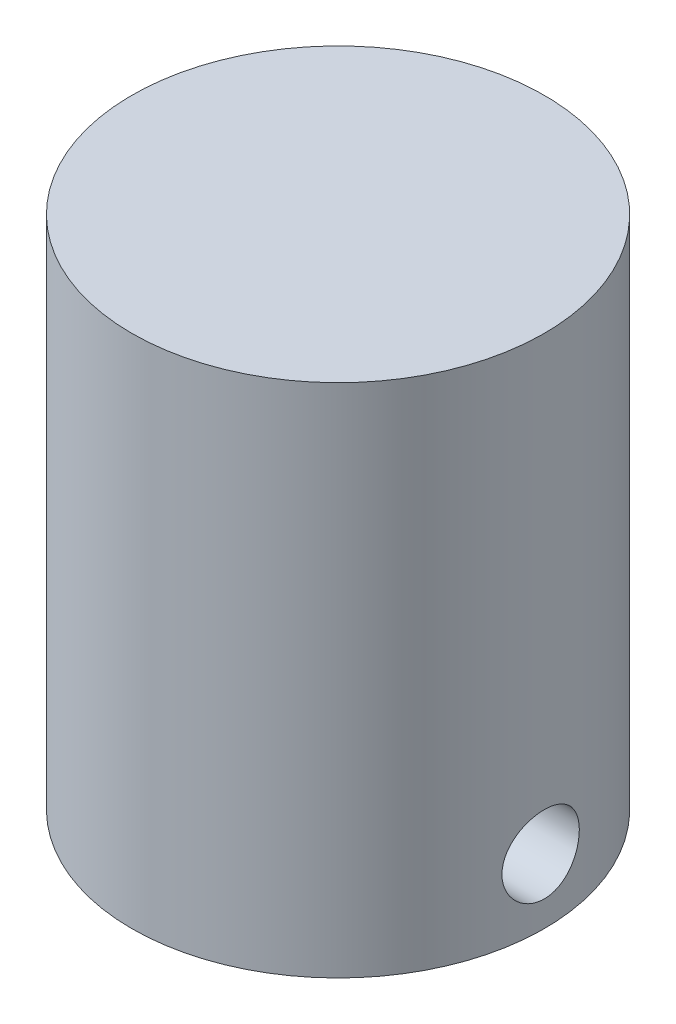
ISO-10303-21;
HEADER;
FILE_DESCRIPTION(('STEP AP214'),'2;1');
FILE_NAME('part.step','',(''),(''),'','','');
FILE_SCHEMA(('AUTOMOTIVE_DESIGN { 1 0 10303 214 1 1 1 1 }'));
ENDSEC;
DATA;
#1=APPLICATION_CONTEXT('core data for automotive mechanical design processes');
#2=APPLICATION_PROTOCOL_DEFINITION('international standard','automotive_design',2000,#1);
#3=PRODUCT_CONTEXT('',#1,'mechanical');
#4=PRODUCT('Part','Part','',(#3));
#5=PRODUCT_RELATED_PRODUCT_CATEGORY('part','',(#4));
#6=PRODUCT_DEFINITION_FORMATION('','',#4);
#7=PRODUCT_DEFINITION_CONTEXT('part definition',#1,'design');
#8=PRODUCT_DEFINITION('design','',#6,#7);
#9=PRODUCT_DEFINITION_SHAPE('','',#8);
#10=(LENGTH_UNIT() NAMED_UNIT(*) SI_UNIT(.MILLI.,.METRE.));
#11=(NAMED_UNIT(*) PLANE_ANGLE_UNIT() SI_UNIT($,.RADIAN.));
#12=(NAMED_UNIT(*) SI_UNIT($,.STERADIAN.) SOLID_ANGLE_UNIT());
#13=UNCERTAINTY_MEASURE_WITH_UNIT(LENGTH_MEASURE(1.E-05),#10,'distance_accuracy_value','');
#14=(GEOMETRIC_REPRESENTATION_CONTEXT(3) GLOBAL_UNCERTAINTY_ASSIGNED_CONTEXT((#13)) GLOBAL_UNIT_ASSIGNED_CONTEXT((#10,
#11,#12)) REPRESENTATION_CONTEXT('',''));
#15=CARTESIAN_POINT('',(0.,0.,0.));
#16=DIRECTION('',(0.,0.,1.));
#17=DIRECTION('',(1.,0.,0.));
#18=AXIS2_PLACEMENT_3D('',#15,#16,#17);
#19=CARTESIAN_POINT('',(0.,20.,0.));
#20=DIRECTION('',(0.,-1.,0.));
#21=DIRECTION('',(0.,0.,-1.));
#22=AXIS2_PLACEMENT_3D('',#19,#20,#21);
#23=CYLINDRICAL_SURFACE('',#22,8.);
#24=CARTESIAN_POINT('',(-8.,1.,0.));
#25=CARTESIAN_POINT('',(-7.99999848833852,1.00000318958828,-0.0834717464654709));
#26=CARTESIAN_POINT('',(-7.99868009921714,1.00699107661938,-0.166984992730098));
#27=CARTESIAN_POINT('',(-7.9935478589052,1.03473999511835,-0.331658129841798));
#28=CARTESIAN_POINT('',(-7.98973190166897,1.05551265063973,-0.412815974152226));
#29=CARTESIAN_POINT('',(-7.98003138765458,1.11017270125934,-0.570372961851801));
#30=CARTESIAN_POINT('',(-7.97414869946483,1.14404825245254,-0.646776330685344));
#31=CARTESIAN_POINT('',(-7.96095710599783,1.22391887692282,-0.792807973094006));
#32=CARTESIAN_POINT('',(-7.9536483161829,1.26991296914482,-0.862436794477323));
#33=CARTESIAN_POINT('',(-7.93831336430504,1.37329976800367,-0.993783715930503));
#34=CARTESIAN_POINT('',(-7.93028034856351,1.43080944467014,-1.05540895503183));
#35=CARTESIAN_POINT('',(-7.9144531845865,1.55534330908756,-1.16819606135369));
#36=CARTESIAN_POINT('',(-7.90665905354527,1.62236817976929,-1.21935717689241));
#37=CARTESIAN_POINT('',(-7.89212551245005,1.76468608836397,-1.31014998665793));
#38=CARTESIAN_POINT('',(-7.88539493886182,1.84004037031724,-1.34968721969605));
#39=CARTESIAN_POINT('',(-7.87384713211987,1.99646891517679,-1.41550524332283));
#40=CARTESIAN_POINT('',(-7.86902973396962,2.07754268411122,-1.44178717713098));
#41=CARTESIAN_POINT('',(-7.8619226957455,2.24211523091441,-1.480050535035));
#42=CARTESIAN_POINT('',(-7.85960445366405,2.32557509720346,-1.49219390192039));
#43=CARTESIAN_POINT('',(-7.85767197152761,2.49337738480825,-1.50233808095346));
#44=CARTESIAN_POINT('',(-7.8580574889876,2.5777197263023,-1.50034016135374));
#45=CARTESIAN_POINT('',(-7.86146292701753,2.74371952526605,-1.48238979602362));
#46=CARTESIAN_POINT('',(-7.86444808147334,2.82539771430015,-1.46662149996045));
#47=CARTESIAN_POINT('',(-7.87266183284666,2.98492841978261,-1.42186799396207));
#48=CARTESIAN_POINT('',(-7.87789052509516,3.0627807735093,-1.39288222239499));
#49=CARTESIAN_POINT('',(-7.89003855292589,3.21298867900027,-1.322336471793));
#50=CARTESIAN_POINT('',(-7.89696783823366,3.28530847058081,-1.28070213532456));
#51=CARTESIAN_POINT('',(-7.91172971602918,3.42200472854023,-1.18609368930416));
#52=CARTESIAN_POINT('',(-7.91956240015522,3.4863803877148,-1.13311842889266));
#53=CARTESIAN_POINT('',(-7.93540001272164,3.60642495567246,-1.01633905685298));
#54=CARTESIAN_POINT('',(-7.94340571024031,3.66194065245174,-0.952377436860682));
#55=CARTESIAN_POINT('',(-7.95857386108318,3.76147724067541,-0.815968037098826));
#56=CARTESIAN_POINT('',(-7.96573630595245,3.80549801687042,-0.743520172255769));
#57=CARTESIAN_POINT('',(-7.97842539677509,3.88081775387002,-0.592034988874667));
#58=CARTESIAN_POINT('',(-7.98394999136289,3.9121007791179,-0.512989564446493));
#59=CARTESIAN_POINT('',(-7.99272505402719,3.96090209309216,-0.350639115398696));
#60=CARTESIAN_POINT('',(-7.99597576367994,3.97842184404536,-0.267334544277786));
#61=CARTESIAN_POINT('',(-7.99980360641981,3.99898603101827,-0.100148652903384));
#62=CARTESIAN_POINT('',(-8.00041950912279,4.00224039152973,-0.0162940126341342));
#63=CARTESIAN_POINT('',(-7.99901543598228,3.99474452045235,0.150761248092185));
#64=CARTESIAN_POINT('',(-7.99699558964431,3.98399497693474,0.233961900480386));
#65=CARTESIAN_POINT('',(-7.99057111500406,3.94897096481663,0.396681573218218));
#66=CARTESIAN_POINT('',(-7.98618522374031,3.92480271746219,0.476224261046064));
#67=CARTESIAN_POINT('',(-7.97551842212498,3.86374229322121,0.630128631824634));
#68=CARTESIAN_POINT('',(-7.96923738311334,3.82684925243421,0.704489962595104));
#69=CARTESIAN_POINT('',(-7.95538030357666,3.74092187184049,0.846816671513215));
#70=CARTESIAN_POINT('',(-7.94779086174563,3.69175926146316,0.914703277015122));
#71=CARTESIAN_POINT('',(-7.93219343489711,3.58286186263764,1.04133832326455));
#72=CARTESIAN_POINT('',(-7.92418541084687,3.52312608699867,1.10008590976087));
#73=CARTESIAN_POINT('',(-7.9085247569745,3.39382768108857,1.20757295872048));
#74=CARTESIAN_POINT('',(-7.90087825860257,3.32414509187461,1.25616916218577));
#75=CARTESIAN_POINT('',(-7.88692985578532,3.17748237547625,1.34096675057787));
#76=CARTESIAN_POINT('',(-7.8806279013735,3.10050251962953,1.37716859613924));
#77=CARTESIAN_POINT('',(-7.87013024209574,2.94179413275746,1.43594673512823));
#78=CARTESIAN_POINT('',(-7.86592440436878,2.86009062044067,1.45858868794786));
#79=CARTESIAN_POINT('',(-7.86007203802415,2.6939527774786,1.48980679326235));
#80=CARTESIAN_POINT('',(-7.8584252206579,2.6095187560296,1.49838453270708));
#81=CARTESIAN_POINT('',(-7.85789199803857,2.44175166855849,1.50117762148355));
#82=CARTESIAN_POINT('',(-7.85896215974293,2.358422419043,1.49561895003499));
#83=CARTESIAN_POINT('',(-7.86364600659998,2.19390857795471,1.47079175378803));
#84=CARTESIAN_POINT('',(-7.86725967655747,2.11272397357256,1.45152331089332));
#85=CARTESIAN_POINT('',(-7.8766050802318,1.95492551520452,1.39991887583263));
#86=CARTESIAN_POINT('',(-7.88233284594965,1.87830340865423,1.36760735397252));
#87=CARTESIAN_POINT('',(-7.8952638755184,1.73153174575916,1.29085868912204));
#88=CARTESIAN_POINT('',(-7.90246724360119,1.66138264715522,1.24642068948186));
#89=CARTESIAN_POINT('',(-7.91767266107745,1.52841631995771,1.14589487339535));
#90=CARTESIAN_POINT('',(-7.92568505353043,1.4657245874329,1.08964259864303));
#91=CARTESIAN_POINT('',(-7.94152833918735,1.35059483753548,0.96742792674229));
#92=CARTESIAN_POINT('',(-7.94935919027328,1.29815917901986,0.901463301891614));
#93=CARTESIAN_POINT('',(-7.96403975968049,1.20458904737294,0.760984945071871));
#94=CARTESIAN_POINT('',(-7.97088000990561,1.16356057150936,0.686399590640516));
#95=CARTESIAN_POINT('',(-7.98271619380687,1.09468236339486,0.531290113653833));
#96=CARTESIAN_POINT('',(-7.98771385879037,1.06682025295309,0.450771651705247));
#97=CARTESIAN_POINT('',(-7.99428290707632,1.03072268558133,0.308347202825153));
#98=CARTESIAN_POINT('',(-7.99641470878206,1.0192213696872,0.24727381025187));
#99=CARTESIAN_POINT('',(-7.9992737995401,1.00385893788355,0.124141247115158));
#100=CARTESIAN_POINT('',(-8.00000112429805,0.999997627744093,0.0620821016527093));
#101=CARTESIAN_POINT('',(-8.,1.,0.));
#102=B_SPLINE_CURVE_WITH_KNOTS('',3,(#24,#25,#26,#27,#28,#29,#30,#31,#32,#33,#34,#35,#36,#37,
#38,#39,#40,#41,#42,#43,#44,#45,#46,#47,#48,#49,#50,#51,#52,#53,#54,#55,#56,#57,#58,#59,#60,#61,
#62,#63,#64,#65,#66,#67,#68,#69,#70,#71,#72,#73,#74,#75,#76,#77,#78,#79,#80,#81,#82,#83,#84,#85,
#86,#87,#88,#89,#90,#91,#92,#93,#94,#95,#96,#97,#98,#99,#100,#101),.UNSPECIFIED.,.T.,.F.,(4,2,2,
2,2,2,2,2,2,2,2,2,2,2,2,2,2,2,2,2,2,2,2,2,2,2,2,2,2,2,2,2,2,2,2,2,2,2,4),(0.,0.250188200964924,
0.500587642535452,0.750761271230907,1.00091465336891,1.2537511801363,1.50660586283617,
1.76146190504358,2.01629596311949,2.26818151445336,2.52004447587256,2.76859000612766,
3.01714609846787,3.26719262629531,3.51726454049859,3.77127768464077,4.02529337544948,
4.27962588321699,4.53393136673745,4.78448174076097,5.03501980464583,5.28360233907828,
5.53220175338032,5.78351778017708,6.03485728413098,6.28953436987299,6.54420198954945,
6.79762627818559,7.05102196946513,7.30039252231748,7.54976158541507,7.79866496207693,
8.04758592655423,8.3002336996638,8.55293951262255,8.80792048916314,9.06266126931173,
9.24874344524409,9.43482089039541),.UNSPECIFIED.);
#103=CARTESIAN_POINT('',(-8.,1.,0.));
#104=VERTEX_POINT('',#103);
#105=EDGE_CURVE('E89',#104,#104,#102,.T.);
#106=ORIENTED_EDGE('',*,*,#105,.T.);
#107=EDGE_LOOP('',(#106));
#108=FACE_BOUND('',#107,.T.);
#109=CARTESIAN_POINT('',(7.85811682275086,2.5,-1.5));
#110=CARTESIAN_POINT('',(7.85811843793494,2.41654279198826,-1.49999679883246));
#111=CARTESIAN_POINT('',(7.85946079760266,2.33304405178161,-1.49301126348936));
#112=CARTESIAN_POINT('',(7.86467851014364,2.16840103841809,-1.46527253251805));
#113=CARTESIAN_POINT('',(7.86855601173205,2.08725882357252,-1.44450765768477));
#114=CARTESIAN_POINT('',(7.87838976464885,1.92973492862913,-1.38987035617788));
#115=CARTESIAN_POINT('',(7.88434407905997,1.85334889069271,-1.35601013954374));
#116=CARTESIAN_POINT('',(7.89765826320959,1.70734644071319,-1.27617565760366));
#117=CARTESIAN_POINT('',(7.90501802325622,1.6377295009967,-1.23020233759193));
#118=CARTESIAN_POINT('',(7.92041614838944,1.50636980080087,-1.12683678942622));
#119=CARTESIAN_POINT('',(7.92846116625679,1.44472351652827,-1.06932292933092));
#120=CARTESIAN_POINT('',(7.94426457664034,1.33189561040044,-0.944771778803551));
#121=CARTESIAN_POINT('',(7.95202295031153,1.28071467557521,-0.877733863624944));
#122=CARTESIAN_POINT('',(7.96645017828405,1.18990062339948,-0.735403894570162));
#123=CARTESIAN_POINT('',(7.97311028052363,1.15035846648058,-0.660052840033866));
#124=CARTESIAN_POINT('',(7.98451608632931,1.08453045772647,-0.503631283250763));
#125=CARTESIAN_POINT('',(7.98926194728334,1.05824351600978,-0.422561251859506));
#126=CARTESIAN_POINT('',(7.99625755123778,1.01997045138887,-0.258002746187416));
#127=CARTESIAN_POINT('',(7.99853565976327,1.00782169407732,-0.174553323244857));
#128=CARTESIAN_POINT('',(8.00043684615594,0.997663112299599,-0.00677167603538324));
#129=CARTESIAN_POINT('',(8.00006015010697,0.999652083860943,0.0775604724476702));
#130=CARTESIAN_POINT('',(7.99671633763241,1.01758777114715,0.243598357899397));
#131=CARTESIAN_POINT('',(7.99378172247214,1.03335936943001,0.325323760451469));
#132=CARTESIAN_POINT('',(7.98568826333561,1.07813564939524,0.484947165715475));
#133=CARTESIAN_POINT('',(7.98052933829966,1.1071408133458,0.562845028826541));
#134=CARTESIAN_POINT('',(7.96851260297339,1.1777277310583,0.713110065751521));
#135=CARTESIAN_POINT('',(7.96164537590825,1.2193794879125,0.785443571838533));
#136=CARTESIAN_POINT('',(7.9469714754285,1.31402566907715,0.922159977214638));
#137=CARTESIAN_POINT('',(7.93916470651164,1.36702124688758,0.986542066910785));
#138=CARTESIAN_POINT('',(7.92333513680567,1.48381570298353,1.10656561896904));
#139=CARTESIAN_POINT('',(7.91531085901621,1.54776778390207,1.16205790757041));
#140=CARTESIAN_POINT('',(7.9000650892462,1.68414953127862,1.2615517185126));
#141=CARTESIAN_POINT('',(7.89284360901351,1.75657932176463,1.30555307271182));
#142=CARTESIAN_POINT('',(7.88001893307121,1.90805827070266,1.38085852224478));
#143=CARTESIAN_POINT('',(7.87441850530261,1.98711845719064,1.41214093645421));
#144=CARTESIAN_POINT('',(7.86551242396689,2.1495011841232,1.46093656975056));
#145=CARTESIAN_POINT('',(7.8622065103862,2.23282324046478,1.47845134901108));
#146=CARTESIAN_POINT('',(7.85831520301005,2.40001932885588,1.49899672649739));
#147=CARTESIAN_POINT('',(7.85768955816137,2.48386611556551,1.50224164285859));
#148=CARTESIAN_POINT('',(7.8591219142084,2.65090345508715,1.49472968881724));
#149=CARTESIAN_POINT('',(7.86117978238611,2.73409404014808,1.48397351086433));
#150=CARTESIAN_POINT('',(7.86770980063205,2.89675290305439,1.44894868195883));
#151=CARTESIAN_POINT('',(7.87216186690878,2.97624625262489,1.4247923858399));
#152=CARTESIAN_POINT('',(7.88296134156619,3.13005718973016,1.3637722437906));
#153=CARTESIAN_POINT('',(7.88930888963281,3.20437439531533,1.32690746128795));
#154=CARTESIAN_POINT('',(7.90327577863685,3.34666761904317,1.2410235311966));
#155=CARTESIAN_POINT('',(7.91090895425315,3.41456053786607,1.19186899639621));
#156=CARTESIAN_POINT('',(7.926548113681,3.54121204021433,1.08298344344247));
#157=CARTESIAN_POINT('',(7.93455413096494,3.59996980155577,1.02325147433084));
#158=CARTESIAN_POINT('',(7.95016624005946,3.70748376353413,0.893949417870386));
#159=CARTESIAN_POINT('',(7.95776555833305,3.75609582660596,0.824258534095891));
#160=CARTESIAN_POINT('',(7.97159404810351,3.84092120617766,0.677574523040141));
#161=CARTESIAN_POINT('',(7.97782327234725,3.87713500002501,0.600581677038529));
#162=CARTESIAN_POINT('',(7.98818057995848,3.93592009786408,0.441877541578684));
#163=CARTESIAN_POINT('',(7.99231954730142,3.95856218756141,0.360193213078988));
#164=CARTESIAN_POINT('',(7.99807642083745,3.98978704828989,0.194096227381571));
#165=CARTESIAN_POINT('',(7.99969459229933,3.99837129866271,0.109683858215851));
#166=CARTESIAN_POINT('',(8.00022227515441,4.00118530151844,-0.0580907602505092));
#167=CARTESIAN_POINT('',(7.99917286625032,3.99563275312953,-0.141449307066268));
#168=CARTESIAN_POINT('',(7.99456866611703,3.97080757223157,-0.306023369279199));
#169=CARTESIAN_POINT('',(7.99101389890671,3.95153507125579,-0.387238905213689));
#170=CARTESIAN_POINT('',(7.98179837978045,3.89990879261628,-0.545106475595484));
#171=CARTESIAN_POINT('',(7.97614135981576,3.86757818711899,-0.621766319318223));
#172=CARTESIAN_POINT('',(7.96333372068771,3.79077954634482,-0.768605631316694));
#173=CARTESIAN_POINT('',(7.95618300146483,3.74631069789335,-0.83878466500327));
#174=CARTESIAN_POINT('',(7.94104779859941,3.64574854555768,-0.971755027780006));
#175=CARTESIAN_POINT('',(7.93305284591272,3.58949796613829,-1.03442623539053));
#176=CARTESIAN_POINT('',(7.91719633538833,3.46729543750729,-1.14951536065485));
#177=CARTESIAN_POINT('',(7.90933480936765,3.40134120962628,-1.2019308632478));
#178=CARTESIAN_POINT('',(7.89455577425926,3.26087354529666,-1.29547633945385));
#179=CARTESIAN_POINT('',(7.88764767280729,3.18628656033236,-1.33649740531872));
#180=CARTESIAN_POINT('',(7.87567084650033,3.03117421002026,-1.40536132423417));
#181=CARTESIAN_POINT('',(7.87060038649116,2.95065453341062,-1.43321661638912));
#182=CARTESIAN_POINT('',(7.86393016292125,2.80824771193409,-1.46929726596175));
#183=CARTESIAN_POINT('',(7.86176310717932,2.74719427623806,-1.4807910573985));
#184=CARTESIAN_POINT('',(7.85885585595504,2.62410153157968,-1.49614351076215));
#185=CARTESIAN_POINT('',(7.85811562163282,2.56206224949967,-1.50000238052127));
#186=CARTESIAN_POINT('',(7.85811682275086,2.5,-1.5));
#187=B_SPLINE_CURVE_WITH_KNOTS('',3,(#109,#110,#111,#112,#113,#114,#115,#116,#117,#118,#119,
#120,#121,#122,#123,#124,#125,#126,#127,#128,#129,#130,#131,#132,#133,#134,#135,#136,#137,#138,
#139,#140,#141,#142,#143,#144,#145,#146,#147,#148,#149,#150,#151,#152,#153,#154,#155,#156,#157,
#158,#159,#160,#161,#162,#163,#164,#165,#166,#167,#168,#169,#170,#171,#172,#173,#174,#175,#176,
#177,#178,#179,#180,#181,#182,#183,#184,#185,#186),.UNSPECIFIED.,.T.,.F.,(4,2,2,2,2,2,2,2,2,2,2,
2,2,2,2,2,2,2,2,2,2,2,2,2,2,2,2,2,2,2,2,2,2,2,2,2,2,2,4),(0.,0.250144505793186,
0.500501302380393,0.750625227978432,1.00072963993908,1.25362335698691,1.50653367069315,
1.76137104348047,2.0161874593964,2.26804275460261,2.51987660200648,2.76855650598725,
3.01724547328425,3.26733691984219,3.51745380911785,3.77140614764064,4.025362201924,
4.27974936118266,4.53410768866488,4.78463248587075,5.03514489338718,5.28358792315368,
5.53204926624317,5.78337862654143,6.03473059394677,6.2894412549587,6.54414210821705,
6.79750269418683,7.0508366166733,7.30029300570138,7.54974700322167,7.79876026530357,
8.0477902135711,8.30038464008745,8.55303847730764,8.80803001818117,9.06278015749119,
9.24880307527214,9.43482092920425),.UNSPECIFIED.);
#188=CARTESIAN_POINT('',(7.85811682275086,2.5,-1.5));
#189=VERTEX_POINT('',#188);
#190=EDGE_CURVE('E83',#189,#189,#187,.T.);
#191=ORIENTED_EDGE('',*,*,#190,.T.);
#192=EDGE_LOOP('',(#191));
#193=FACE_BOUND('',#192,.T.);
#194=CARTESIAN_POINT('',(0.,20.,0.));
#195=DIRECTION('',(0.,1.,0.));
#196=DIRECTION('',(0.,0.,1.));
#197=AXIS2_PLACEMENT_3D('',#194,#195,#196);
#198=CIRCLE('',#197,8.);
#199=CARTESIAN_POINT('',(0.,20.,8.));
#200=VERTEX_POINT('',#199);
#201=EDGE_CURVE('E10',#200,#200,#198,.T.);
#202=ORIENTED_EDGE('',*,*,#201,.F.);
#203=EDGE_LOOP('',(#202));
#204=FACE_BOUND('',#203,.T.);
#205=CARTESIAN_POINT('',(0.,0.,0.));
#206=DIRECTION('',(0.,1.,0.));
#207=DIRECTION('',(0.,0.,1.));
#208=AXIS2_PLACEMENT_3D('',#205,#206,#207);
#209=CIRCLE('',#208,8.);
#210=CARTESIAN_POINT('',(0.,0.,8.));
#211=VERTEX_POINT('',#210);
#212=EDGE_CURVE('E51',#211,#211,#209,.T.);
#213=ORIENTED_EDGE('',*,*,#212,.T.);
#214=EDGE_LOOP('',(#213));
#215=FACE_BOUND('',#214,.T.);
#216=ADVANCED_FACE('F37',(#108,#193,#204,#215),#23,.T.);
#217=CARTESIAN_POINT('',(0.,20.,0.));
#218=DIRECTION('',(0.,1.,0.));
#219=DIRECTION('',(0.,0.,1.));
#220=AXIS2_PLACEMENT_3D('',#217,#218,#219);
#221=PLANE('',#220);
#222=ORIENTED_EDGE('',*,*,#201,.T.);
#223=EDGE_LOOP('',(#222));
#224=FACE_BOUND('',#223,.T.);
#225=ADVANCED_FACE('F107',(#224),#221,.T.);
#226=CARTESIAN_POINT('',(0.,0.,0.));
#227=DIRECTION('',(0.,1.,0.));
#228=DIRECTION('',(0.,0.,1.));
#229=AXIS2_PLACEMENT_3D('',#226,#227,#228);
#230=PLANE('',#229);
#231=CARTESIAN_POINT('',(0.,0.,0.));
#232=DIRECTION('',(0.,-1.,0.));
#233=DIRECTION('',(0.,0.,-1.));
#234=AXIS2_PLACEMENT_3D('',#231,#232,#233);
#235=CIRCLE('',#234,4.);
#236=CARTESIAN_POINT('',(0.,0.,-4.));
#237=VERTEX_POINT('',#236);
#238=EDGE_CURVE('E60',#237,#237,#235,.T.);
#239=ORIENTED_EDGE('',*,*,#238,.F.);
#240=EDGE_LOOP('',(#239));
#241=FACE_BOUND('',#240,.T.);
#242=ORIENTED_EDGE('',*,*,#212,.F.);
#243=EDGE_LOOP('',(#242));
#244=FACE_BOUND('',#243,.T.);
#245=ADVANCED_FACE('F104',(#241,#244),#230,.F.);
#246=CARTESIAN_POINT('',(0.,12.,0.));
#247=DIRECTION('',(0.,-1.,0.));
#248=DIRECTION('',(0.,0.,-1.));
#249=AXIS2_PLACEMENT_3D('',#246,#247,#248);
#250=CYLINDRICAL_SURFACE('',#249,4.);
#251=CARTESIAN_POINT('',(-3.70809924354783,2.5,-1.5));
#252=CARTESIAN_POINT('',(-3.70809640633806,2.41899251627921,-1.50000304106109));
#253=CARTESIAN_POINT('',(-3.71078260240986,2.33800507749636,-1.49341597549487));
#254=CARTESIAN_POINT('',(-3.72116159304967,2.1784719170868,-1.46736187895468));
#255=CARTESIAN_POINT('',(-3.72885423767112,2.09992612240499,-1.44789523373263));
#256=CARTESIAN_POINT('',(-3.748254802809,1.94762462838647,-1.39689657610574));
#257=CARTESIAN_POINT('',(-3.7599530956926,1.87385794334892,-1.36539347266348));
#258=CARTESIAN_POINT('',(-3.78603134206598,1.73262810318116,-1.29131856742698));
#259=CARTESIAN_POINT('',(-3.80041210067323,1.66516684971748,-1.24874344095039));
#260=CARTESIAN_POINT('',(-3.83103574665713,1.53510968837718,-1.15146661374162));
#261=CARTESIAN_POINT('',(-3.84733341923603,1.47287147037061,-1.09630381213306));
#262=CARTESIAN_POINT('',(-3.87949750628547,1.35827718532851,-0.976395839778926));
#263=CARTESIAN_POINT('',(-3.89536382814785,1.30592322625815,-0.91164863025668));
#264=CARTESIAN_POINT('',(-3.92552873936553,1.21086048770439,-0.7716946551776));
#265=CARTESIAN_POINT('',(-3.93975561223505,1.16854052528414,-0.696206947538028));
#266=CARTESIAN_POINT('',(-3.96438007973848,1.09734882747509,-0.538555771965247));
#267=CARTESIAN_POINT('',(-3.97477900217006,1.06847242800803,-0.456394630933536));
#268=CARTESIAN_POINT('',(-3.9901869710344,1.02624210422538,-0.291489341676832));
#269=CARTESIAN_POINT('',(-3.99540915214774,1.01227237255954,-0.208923197281596));
#270=CARTESIAN_POINT('',(-4.0006401410794,0.998278799055012,-0.042464363794786));
#271=CARTESIAN_POINT('',(-4.00065064414902,0.998250422381291,0.041427885062833));
#272=CARTESIAN_POINT('',(-3.99559265903894,1.01178176146517,0.203743543064476));
#273=CARTESIAN_POINT('',(-3.99077541996683,1.02466929794882,0.2822321782669));
#274=CARTESIAN_POINT('',(-3.97693274932263,1.06253591522555,0.435839217984391));
#275=CARTESIAN_POINT('',(-3.96790701975578,1.08751585226204,0.510957383430298));
#276=CARTESIAN_POINT('',(-3.94637769167531,1.14917045167585,0.656989017303104));
#277=CARTESIAN_POINT('',(-3.93382539470077,1.18601000526841,0.727825392287309));
#278=CARTESIAN_POINT('',(-3.90651310225279,1.27019209692939,0.862486607957559));
#279=CARTESIAN_POINT('',(-3.8917523951284,1.3175380230176,0.926309176932322));
#280=CARTESIAN_POINT('',(-3.86052529655816,1.42462728628319,1.04909048680093));
#281=CARTESIAN_POINT('',(-3.84400963763883,1.48493391565043,1.10754614526348));
#282=CARTESIAN_POINT('',(-3.81182460645722,1.61459299332156,1.21370395569342));
#283=CARTESIAN_POINT('',(-3.79615544748847,1.68394770658664,1.261403406929));
#284=CARTESIAN_POINT('',(-3.76712703500335,1.83171946746282,1.34565611808151));
#285=CARTESIAN_POINT('',(-3.75382677150277,1.91030349368607,1.38193847851831));
#286=CARTESIAN_POINT('',(-3.73172438629002,2.07309622516757,1.44056464441501));
#287=CARTESIAN_POINT('',(-3.72291976205783,2.15730177159369,1.46291620605595));
#288=CARTESIAN_POINT('',(-3.71139597222848,2.32397596231595,1.49190191709668));
#289=CARTESIAN_POINT('',(-3.70836785241537,2.40628410553614,1.49933521158966));
#290=CARTESIAN_POINT('',(-3.70786539525016,2.57100935674174,1.50057885636272));
#291=CARTESIAN_POINT('',(-3.71038967003987,2.65342643235247,1.49439261093762));
#292=CARTESIAN_POINT('',(-3.72039381629735,2.81192992228768,1.46929733520157));
#293=CARTESIAN_POINT('',(-3.72763276216449,2.88813113576466,1.45100618334225));
#294=CARTESIAN_POINT('',(-3.74596487046361,3.03634794472019,1.40299774640638));
#295=CARTESIAN_POINT('',(-3.75705882250173,3.10836267916813,1.37327812034623));
#296=CARTESIAN_POINT('',(-3.7823624311608,3.2491644380762,1.30200292275278));
#297=CARTESIAN_POINT('',(-3.79667328892065,3.31772929213734,1.26004545177047));
#298=CARTESIAN_POINT('',(-3.82662814294291,3.44712898172604,1.16591317862479));
#299=CARTESIAN_POINT('',(-3.84227262594077,3.50796097462463,1.11373463696435));
#300=CARTESIAN_POINT('',(-3.87433046553184,3.6241683731951,0.996727340900939));
#301=CARTESIAN_POINT('',(-3.89072969357028,3.67895340876875,0.931306341491063));
#302=CARTESIAN_POINT('',(-3.92149874963302,3.77683836758944,0.791797471753152));
#303=CARTESIAN_POINT('',(-3.93586857107664,3.81993825294584,0.717709573322674));
#304=CARTESIAN_POINT('',(-3.96094985704552,3.89294605619961,0.563016329468477));
#305=CARTESIAN_POINT('',(-3.9716738133801,3.9228991237926,0.482434433064627));
#306=CARTESIAN_POINT('',(-3.98829436712571,3.96865641384992,0.316881887523255));
#307=CARTESIAN_POINT('',(-3.99419323299412,3.9844672854224,0.231913320723594));
#308=CARTESIAN_POINT('',(-4.00028407317073,4.00077440275483,0.0653355852738163));
#309=CARTESIAN_POINT('',(-4.00078860953764,4.00210948305899,-0.0161807680608445));
#310=CARTESIAN_POINT('',(-3.99684889809223,3.99158484055461,-0.178226786412423));
#311=CARTESIAN_POINT('',(-3.9924052471313,3.97972670911414,-0.258756569245256));
#312=CARTESIAN_POINT('',(-3.97921089603771,3.94374114850638,-0.414548248377125));
#313=CARTESIAN_POINT('',(-3.97056791378017,3.91992009412164,-0.489890731068834));
#314=CARTESIAN_POINT('',(-3.9498778362099,3.86098998661564,-0.635515473006389));
#315=CARTESIAN_POINT('',(-3.93783009655664,3.82587879669525,-0.705796771275542));
#316=CARTESIAN_POINT('',(-3.91090618300074,3.74368605649519,-0.842540176994412));
#317=CARTESIAN_POINT('',(-3.89593240108828,3.69616335948585,-0.908717548846848));
#318=CARTESIAN_POINT('',(-3.86499507694844,3.5911921698124,-1.03241734752336));
#319=CARTESIAN_POINT('',(-3.84903118274027,3.53374013419213,-1.0899366712559));
#320=CARTESIAN_POINT('',(-3.81688129739175,3.40693586835494,-1.19781214236196));
#321=CARTESIAN_POINT('',(-3.8007280534916,3.33711559784569,-1.24762999816025));
#322=CARTESIAN_POINT('',(-3.77098325003638,3.18958413042668,-1.33484709556843));
#323=CARTESIAN_POINT('',(-3.75739195631216,3.11187211594652,-1.37224504878157));
#324=CARTESIAN_POINT('',(-3.73402269853266,2.9470443190246,-1.4346588697426));
#325=CARTESIAN_POINT('',(-3.7244380329086,2.85966563348822,-1.45906002899523));
#326=CARTESIAN_POINT('',(-3.71147994336315,2.68151472804421,-1.49172356722079));
#327=CARTESIAN_POINT('',(-3.70810242179736,2.59074478729001,-1.49999659339571));
#328=CARTESIAN_POINT('',(-3.70809924354783,2.5,-1.5));
#329=B_SPLINE_CURVE_WITH_KNOTS('',3,(#251,#252,#253,#254,#255,#256,#257,#258,#259,#260,#261,
#262,#263,#264,#265,#266,#267,#268,#269,#270,#271,#272,#273,#274,#275,#276,#277,#278,#279,#280,
#281,#282,#283,#284,#285,#286,#287,#288,#289,#290,#291,#292,#293,#294,#295,#296,#297,#298,#299,
#300,#301,#302,#303,#304,#305,#306,#307,#308,#309,#310,#311,#312,#313,#314,#315,#316,#317,#318,
#319,#320,#321,#322,#323,#324,#325,#326,#327,#328),.UNSPECIFIED.,.T.,.F.,(4,2,2,2,2,2,2,2,2,2,2,
2,2,2,2,2,2,2,2,2,2,2,2,2,2,2,2,2,2,2,2,2,2,2,2,2,2,2,4),(0.,0.24268454141617,0.485361814598854,
0.72745985675703,0.969630679682933,1.22274652401128,1.47591628822983,1.73770072136421,
1.9993942638133,2.24980018489679,2.50012465404857,2.73806472803194,2.97602165263335,
3.21744131210668,3.45893893628976,3.71456675065874,3.97025867827334,4.23162592252966,
4.49284751635474,4.73965657740485,4.98640395388884,5.22143845928198,5.45652113429526,
5.70041561005821,5.94439948466355,6.20385016993624,6.46330169650178,6.72185508890168,
6.98028685560127,7.22365720549936,7.46699820319479,7.7044027400389,7.94185223512831,
8.18928323676986,8.43680270894964,8.69738599542079,8.95799630544242,9.23003178870926,
9.50188762323053),.UNSPECIFIED.);
#330=CARTESIAN_POINT('',(-3.70809924354783,2.5,-1.5));
#331=VERTEX_POINT('',#330);
#332=EDGE_CURVE('E41',#331,#331,#329,.T.);
#333=ORIENTED_EDGE('',*,*,#332,.T.);
#334=EDGE_LOOP('',(#333));
#335=FACE_BOUND('',#334,.T.);
#336=CARTESIAN_POINT('',(3.70809924354783,2.5,-1.5));
#337=CARTESIAN_POINT('',(3.70809640633806,2.58100748372079,-1.50000304106109));
#338=CARTESIAN_POINT('',(3.71078260240986,2.66199492250364,-1.49341597549487));
#339=CARTESIAN_POINT('',(3.72116159304967,2.8215280829132,-1.46736187895468));
#340=CARTESIAN_POINT('',(3.72885423767112,2.90007387759501,-1.44789523373263));
#341=CARTESIAN_POINT('',(3.748254802809,3.05237537161353,-1.39689657610574));
#342=CARTESIAN_POINT('',(3.7599530956926,3.12614205665108,-1.36539347266348));
#343=CARTESIAN_POINT('',(3.78603134206598,3.26737189681884,-1.29131856742698));
#344=CARTESIAN_POINT('',(3.80041210067323,3.33483315028252,-1.24874344095039));
#345=CARTESIAN_POINT('',(3.83103574665713,3.46489031162282,-1.15146661374162));
#346=CARTESIAN_POINT('',(3.84733341923603,3.52712852962939,-1.09630381213306));
#347=CARTESIAN_POINT('',(3.87949750628547,3.64172281467149,-0.976395839778926));
#348=CARTESIAN_POINT('',(3.89536382814785,3.69407677374185,-0.911648630256679));
#349=CARTESIAN_POINT('',(3.92552873936553,3.78913951229561,-0.7716946551776));
#350=CARTESIAN_POINT('',(3.93975561223505,3.83145947471586,-0.696206947538028));
#351=CARTESIAN_POINT('',(3.96438007973848,3.90265117252491,-0.538555771965247));
#352=CARTESIAN_POINT('',(3.97477900217006,3.93152757199197,-0.456394630933536));
#353=CARTESIAN_POINT('',(3.9901869710344,3.97375789577462,-0.291489341676832));
#354=CARTESIAN_POINT('',(3.99540915214774,3.98772762744046,-0.208923197281596));
#355=CARTESIAN_POINT('',(4.0006401410794,4.00172120094499,-0.0424643637947863));
#356=CARTESIAN_POINT('',(4.00065064414902,4.00174957761871,0.0414278850628327));
#357=CARTESIAN_POINT('',(3.99559265903894,3.98821823853483,0.203743543064476));
#358=CARTESIAN_POINT('',(3.99077541996683,3.97533070205119,0.2822321782669));
#359=CARTESIAN_POINT('',(3.97693274932263,3.93746408477445,0.435839217984391));
#360=CARTESIAN_POINT('',(3.96790701975578,3.91248414773796,0.510957383430298));
#361=CARTESIAN_POINT('',(3.94637769167531,3.85082954832415,0.656989017303103));
#362=CARTESIAN_POINT('',(3.93382539470077,3.81398999473159,0.727825392287308));
#363=CARTESIAN_POINT('',(3.90651310225279,3.72980790307061,0.862486607957558));
#364=CARTESIAN_POINT('',(3.8917523951284,3.6824619769824,0.926309176932322));
#365=CARTESIAN_POINT('',(3.86052529655816,3.57537271371681,1.04909048680093));
#366=CARTESIAN_POINT('',(3.84400963763883,3.51506608434957,1.10754614526348));
#367=CARTESIAN_POINT('',(3.81182460645722,3.38540700667844,1.21370395569342));
#368=CARTESIAN_POINT('',(3.79615544748847,3.31605229341336,1.261403406929));
#369=CARTESIAN_POINT('',(3.76712703500335,3.16828053253718,1.34565611808151));
#370=CARTESIAN_POINT('',(3.75382677150277,3.08969650631393,1.38193847851831));
#371=CARTESIAN_POINT('',(3.73172438629002,2.92690377483243,1.44056464441501));
#372=CARTESIAN_POINT('',(3.72291976205783,2.84269822840631,1.46291620605595));
#373=CARTESIAN_POINT('',(3.71139597222848,2.67602403768405,1.49190191709668));
#374=CARTESIAN_POINT('',(3.70836785241537,2.59371589446386,1.49933521158966));
#375=CARTESIAN_POINT('',(3.70786539525016,2.42899064325826,1.50057885636272));
#376=CARTESIAN_POINT('',(3.71038967003987,2.34657356764753,1.49439261093762));
#377=CARTESIAN_POINT('',(3.72039381629735,2.18807007771232,1.46929733520157));
#378=CARTESIAN_POINT('',(3.72763276216449,2.11186886423534,1.45100618334225));
#379=CARTESIAN_POINT('',(3.74596487046362,1.96365205527981,1.40299774640638));
#380=CARTESIAN_POINT('',(3.75705882250173,1.89163732083187,1.37327812034623));
#381=CARTESIAN_POINT('',(3.7823624311608,1.7508355619238,1.30200292275278));
#382=CARTESIAN_POINT('',(3.79667328892065,1.68227070786266,1.26004545177047));
#383=CARTESIAN_POINT('',(3.82662814294291,1.55287101827396,1.16591317862479));
#384=CARTESIAN_POINT('',(3.84227262594077,1.49203902537537,1.11373463696435));
#385=CARTESIAN_POINT('',(3.87433046553184,1.3758316268049,0.996727340900938));
#386=CARTESIAN_POINT('',(3.89072969357028,1.32104659123125,0.931306341491062));
#387=CARTESIAN_POINT('',(3.92149874963302,1.22316163241056,0.791797471753152));
#388=CARTESIAN_POINT('',(3.93586857107664,1.18006174705416,0.717709573322674));
#389=CARTESIAN_POINT('',(3.96094985704552,1.10705394380039,0.563016329468478));
#390=CARTESIAN_POINT('',(3.9716738133801,1.0771008762074,0.482434433064628));
#391=CARTESIAN_POINT('',(3.98829436712571,1.03134358615008,0.316881887523256));
#392=CARTESIAN_POINT('',(3.99419323299412,1.0155327145776,0.231913320723594));
#393=CARTESIAN_POINT('',(4.00028407317073,0.999225597245175,0.0653355852738162));
#394=CARTESIAN_POINT('',(4.00078860953764,0.997890516941009,-0.0161807680608447));
#395=CARTESIAN_POINT('',(3.99684889809223,1.00841515944539,-0.178226786412423));
#396=CARTESIAN_POINT('',(3.9924052471313,1.02027329088586,-0.258756569245256));
#397=CARTESIAN_POINT('',(3.97921089603771,1.05625885149362,-0.414548248377125));
#398=CARTESIAN_POINT('',(3.97056791378017,1.08007990587836,-0.489890731068834));
#399=CARTESIAN_POINT('',(3.9498778362099,1.13901001338436,-0.635515473006389));
#400=CARTESIAN_POINT('',(3.93783009655664,1.17412120330475,-0.705796771275542));
#401=CARTESIAN_POINT('',(3.91090618300074,1.25631394350481,-0.842540176994412));
#402=CARTESIAN_POINT('',(3.89593240108829,1.30383664051415,-0.908717548846849));
#403=CARTESIAN_POINT('',(3.86499507694844,1.4088078301876,-1.03241734752336));
#404=CARTESIAN_POINT('',(3.84903118274027,1.46625986580787,-1.0899366712559));
#405=CARTESIAN_POINT('',(3.81688129739175,1.59306413164506,-1.19781214236196));
#406=CARTESIAN_POINT('',(3.8007280534916,1.66288440215431,-1.24762999816025));
#407=CARTESIAN_POINT('',(3.77098325003638,1.81041586957332,-1.33484709556843));
#408=CARTESIAN_POINT('',(3.75739195631216,1.88812788405348,-1.37224504878157));
#409=CARTESIAN_POINT('',(3.73402269853266,2.0529556809754,-1.4346588697426));
#410=CARTESIAN_POINT('',(3.7244380329086,2.14033436651178,-1.45906002899523));
#411=CARTESIAN_POINT('',(3.71147994336315,2.31848527195579,-1.49172356722079));
#412=CARTESIAN_POINT('',(3.70810242179736,2.40925521270999,-1.49999659339571));
#413=CARTESIAN_POINT('',(3.70809924354783,2.5,-1.5));
#414=B_SPLINE_CURVE_WITH_KNOTS('',3,(#336,#337,#338,#339,#340,#341,#342,#343,#344,#345,#346,
#347,#348,#349,#350,#351,#352,#353,#354,#355,#356,#357,#358,#359,#360,#361,#362,#363,#364,#365,
#366,#367,#368,#369,#370,#371,#372,#373,#374,#375,#376,#377,#378,#379,#380,#381,#382,#383,#384,
#385,#386,#387,#388,#389,#390,#391,#392,#393,#394,#395,#396,#397,#398,#399,#400,#401,#402,#403,
#404,#405,#406,#407,#408,#409,#410,#411,#412,#413),.UNSPECIFIED.,.T.,.F.,(4,2,2,2,2,2,2,2,2,2,2,
2,2,2,2,2,2,2,2,2,2,2,2,2,2,2,2,2,2,2,2,2,2,2,2,2,2,2,4),(0.,0.24268454141617,0.485361814598854,
0.72745985675703,0.969630679682933,1.22274652401128,1.47591628822983,1.73770072136421,
1.9993942638133,2.24980018489679,2.50012465404857,2.73806472803194,2.97602165263335,
3.21744131210668,3.45893893628976,3.71456675065874,3.97025867827335,4.23162592252966,
4.49284751635474,4.73965657740485,4.98640395388884,5.22143845928198,5.45652113429526,
5.70041561005821,5.94439948466355,6.20385016993624,6.46330169650178,6.72185508890168,
6.98028685560127,7.22365720549936,7.46699820319479,7.7044027400389,7.94185223512831,
8.18928323676987,8.43680270894964,8.69738599542079,8.95799630544242,9.23003178870926,
9.50188762323053),.UNSPECIFIED.);
#415=CARTESIAN_POINT('',(3.70809924354783,2.5,-1.5));
#416=VERTEX_POINT('',#415);
#417=EDGE_CURVE('E62',#416,#416,#414,.T.);
#418=ORIENTED_EDGE('',*,*,#417,.T.);
#419=EDGE_LOOP('',(#418));
#420=FACE_BOUND('',#419,.T.);
#421=CARTESIAN_POINT('',(0.,12.,0.));
#422=DIRECTION('',(0.,-1.,0.));
#423=DIRECTION('',(0.,0.,-1.));
#424=AXIS2_PLACEMENT_3D('',#421,#422,#423);
#425=CIRCLE('',#424,4.);
#426=CARTESIAN_POINT('',(0.,12.,-4.));
#427=VERTEX_POINT('',#426);
#428=EDGE_CURVE('E57',#427,#427,#425,.T.);
#429=ORIENTED_EDGE('',*,*,#428,.F.);
#430=EDGE_LOOP('',(#429));
#431=FACE_BOUND('',#430,.T.);
#432=ORIENTED_EDGE('',*,*,#238,.T.);
#433=EDGE_LOOP('',(#432));
#434=FACE_BOUND('',#433,.T.);
#435=ADVANCED_FACE('F68',(#335,#420,#431,#434),#250,.F.);
#436=CARTESIAN_POINT('',(0.,12.,0.));
#437=DIRECTION('',(0.,-1.,0.));
#438=DIRECTION('',(0.,0.,-1.));
#439=AXIS2_PLACEMENT_3D('',#436,#437,#438);
#440=PLANE('',#439);
#441=ORIENTED_EDGE('',*,*,#428,.T.);
#442=EDGE_LOOP('',(#441));
#443=FACE_BOUND('',#442,.T.);
#444=ADVANCED_FACE('F77',(#443),#440,.T.);
#445=CARTESIAN_POINT('',(-8.,2.5,0.));
#446=DIRECTION('',(1.,0.,0.));
#447=DIRECTION('',(0.,0.,-1.));
#448=AXIS2_PLACEMENT_3D('',#445,#446,#447);
#449=CYLINDRICAL_SURFACE('',#448,1.5);
#450=ORIENTED_EDGE('',*,*,#417,.F.);
#451=EDGE_LOOP('',(#450));
#452=FACE_BOUND('',#451,.T.);
#453=ORIENTED_EDGE('',*,*,#190,.F.);
#454=EDGE_LOOP('',(#453));
#455=FACE_BOUND('',#454,.T.);
#456=ADVANCED_FACE('F75',(#452,#455),#449,.F.);
#457=ORIENTED_EDGE('',*,*,#332,.F.);
#458=EDGE_LOOP('',(#457));
#459=FACE_BOUND('',#458,.T.);
#460=ORIENTED_EDGE('',*,*,#105,.F.);
#461=EDGE_LOOP('',(#460));
#462=FACE_BOUND('',#461,.T.);
#463=ADVANCED_FACE('F72',(#459,#462),#449,.F.);
#464=CLOSED_SHELL('',(#216,#225,#245,#435,#444,#456,#463));
#465=MANIFOLD_SOLID_BREP('B2',#464);
#466=ADVANCED_BREP_SHAPE_REPRESENTATION('',(#18,#465),#14);
#467=SHAPE_DEFINITION_REPRESENTATION(#9,#466);
ENDSEC;
END-ISO-10303-21;
